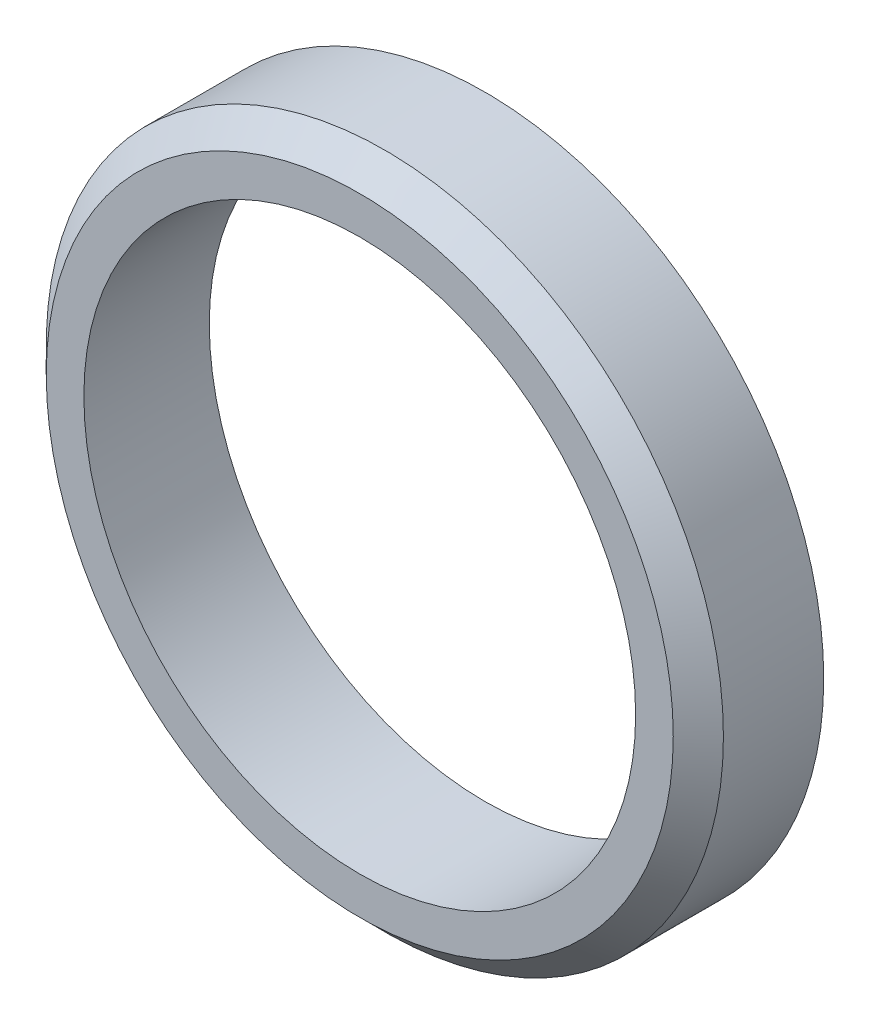
ISO-10303-21;
HEADER;
FILE_DESCRIPTION(('STEP AP214'),'2;1');
FILE_NAME('part.step','',(''),(''),'','','');
FILE_SCHEMA(('AUTOMOTIVE_DESIGN { 1 0 10303 214 1 1 1 1 }'));
ENDSEC;
DATA;
#1=APPLICATION_CONTEXT('core data for automotive mechanical design processes');
#2=APPLICATION_PROTOCOL_DEFINITION('international standard','automotive_design',2000,#1);
#3=PRODUCT_CONTEXT('',#1,'mechanical');
#4=PRODUCT('Part','Part','',(#3));
#5=PRODUCT_RELATED_PRODUCT_CATEGORY('part','',(#4));
#6=PRODUCT_DEFINITION_FORMATION('','',#4);
#7=PRODUCT_DEFINITION_CONTEXT('part definition',#1,'design');
#8=PRODUCT_DEFINITION('design','',#6,#7);
#9=PRODUCT_DEFINITION_SHAPE('','',#8);
#10=(LENGTH_UNIT() NAMED_UNIT(*) SI_UNIT(.MILLI.,.METRE.));
#11=(NAMED_UNIT(*) PLANE_ANGLE_UNIT() SI_UNIT($,.RADIAN.));
#12=(NAMED_UNIT(*) SI_UNIT($,.STERADIAN.) SOLID_ANGLE_UNIT());
#13=UNCERTAINTY_MEASURE_WITH_UNIT(LENGTH_MEASURE(1.E-05),#10,'distance_accuracy_value','');
#14=(GEOMETRIC_REPRESENTATION_CONTEXT(3) GLOBAL_UNCERTAINTY_ASSIGNED_CONTEXT((#13)) GLOBAL_UNIT_ASSIGNED_CONTEXT((#10,
#11,#12)) REPRESENTATION_CONTEXT('',''));
#15=CARTESIAN_POINT('',(0.,0.,0.));
#16=DIRECTION('',(0.,0.,1.));
#17=DIRECTION('',(1.,0.,0.));
#18=AXIS2_PLACEMENT_3D('',#15,#16,#17);
#19=CARTESIAN_POINT('',(0.,0.,25.));
#20=DIRECTION('',(0.,0.,-1.));
#21=DIRECTION('',(-1.,0.,0.));
#22=AXIS2_PLACEMENT_3D('',#19,#20,#21);
#23=CYLINDRICAL_SURFACE('',#22,67.5);
#24=CARTESIAN_POINT('',(0.,0.,20.));
#25=DIRECTION('',(0.,0.,1.));
#26=DIRECTION('',(1.,0.,0.));
#27=AXIS2_PLACEMENT_3D('',#24,#25,#26);
#28=CIRCLE('',#27,67.5);
#29=CARTESIAN_POINT('',(67.5,0.,20.));
#30=VERTEX_POINT('',#29);
#31=EDGE_CURVE('E10',#30,#30,#28,.F.);
#32=ORIENTED_EDGE('',*,*,#31,.T.);
#33=EDGE_LOOP('',(#32));
#34=FACE_BOUND('',#33,.T.);
#35=CARTESIAN_POINT('',(0.,0.,0.));
#36=DIRECTION('',(0.,0.,1.));
#37=DIRECTION('',(1.,0.,0.));
#38=AXIS2_PLACEMENT_3D('',#35,#36,#37);
#39=CIRCLE('',#38,67.5);
#40=CARTESIAN_POINT('',(67.5,0.,0.));
#41=VERTEX_POINT('',#40);
#42=EDGE_CURVE('E43',#41,#41,#39,.T.);
#43=ORIENTED_EDGE('',*,*,#42,.T.);
#44=EDGE_LOOP('',(#43));
#45=FACE_BOUND('',#44,.T.);
#46=ADVANCED_FACE('F32',(#34,#45),#23,.T.);
#47=CARTESIAN_POINT('',(0.,0.,25.));
#48=DIRECTION('',(0.,0.,1.));
#49=DIRECTION('',(1.,0.,0.));
#50=AXIS2_PLACEMENT_3D('',#47,#48,#49);
#51=PLANE('',#50);
#52=CARTESIAN_POINT('',(0.,0.,25.));
#53=DIRECTION('',(0.,0.,-1.));
#54=DIRECTION('',(-1.,0.,0.));
#55=AXIS2_PLACEMENT_3D('',#52,#53,#54);
#56=CIRCLE('',#55,55.);
#57=CARTESIAN_POINT('',(-55.,0.,25.));
#58=VERTEX_POINT('',#57);
#59=EDGE_CURVE('E47',#58,#58,#56,.T.);
#60=ORIENTED_EDGE('',*,*,#59,.T.);
#61=EDGE_LOOP('',(#60));
#62=FACE_BOUND('',#61,.T.);
#63=CARTESIAN_POINT('',(0.,0.,25.));
#64=DIRECTION('',(0.,0.,1.));
#65=DIRECTION('',(1.,0.,0.));
#66=AXIS2_PLACEMENT_3D('',#63,#64,#65);
#67=CIRCLE('',#66,62.5);
#68=CARTESIAN_POINT('',(62.5,0.,25.));
#69=VERTEX_POINT('',#68);
#70=EDGE_CURVE('E39',#69,#69,#67,.T.);
#71=ORIENTED_EDGE('',*,*,#70,.T.);
#72=EDGE_LOOP('',(#71));
#73=FACE_BOUND('',#72,.T.);
#74=ADVANCED_FACE('F56',(#62,#73),#51,.T.);
#75=CARTESIAN_POINT('',(0.,0.,0.));
#76=DIRECTION('',(0.,0.,1.));
#77=DIRECTION('',(1.,0.,0.));
#78=AXIS2_PLACEMENT_3D('',#75,#76,#77);
#79=PLANE('',#78);
#80=CARTESIAN_POINT('',(0.,0.,0.));
#81=DIRECTION('',(0.,0.,-1.));
#82=DIRECTION('',(-1.,0.,0.));
#83=AXIS2_PLACEMENT_3D('',#80,#81,#82);
#84=CIRCLE('',#83,55.);
#85=CARTESIAN_POINT('',(-55.,0.,0.));
#86=VERTEX_POINT('',#85);
#87=EDGE_CURVE('E50',#86,#86,#84,.T.);
#88=ORIENTED_EDGE('',*,*,#87,.F.);
#89=EDGE_LOOP('',(#88));
#90=FACE_BOUND('',#89,.T.);
#91=ORIENTED_EDGE('',*,*,#42,.F.);
#92=EDGE_LOOP('',(#91));
#93=FACE_BOUND('',#92,.T.);
#94=ADVANCED_FACE('F64',(#90,#93),#79,.F.);
#95=CARTESIAN_POINT('',(0.,0.,25.));
#96=DIRECTION('',(0.,0.,-1.));
#97=DIRECTION('',(-1.,0.,0.));
#98=AXIS2_PLACEMENT_3D('',#95,#96,#97);
#99=CONICAL_SURFACE('',#98,62.5,0.785398163397447);
#100=ORIENTED_EDGE('',*,*,#31,.F.);
#101=EDGE_LOOP('',(#100));
#102=FACE_BOUND('',#101,.T.);
#103=ORIENTED_EDGE('',*,*,#70,.F.);
#104=EDGE_LOOP('',(#103));
#105=FACE_BOUND('',#104,.T.);
#106=ADVANCED_FACE('F34',(#102,#105),#99,.T.);
#107=CARTESIAN_POINT('',(0.,0.,25.));
#108=DIRECTION('',(0.,0.,-1.));
#109=DIRECTION('',(-1.,0.,0.));
#110=AXIS2_PLACEMENT_3D('',#107,#108,#109);
#111=CYLINDRICAL_SURFACE('',#110,55.);
#112=ORIENTED_EDGE('',*,*,#59,.F.);
#113=EDGE_LOOP('',(#112));
#114=FACE_BOUND('',#113,.T.);
#115=ORIENTED_EDGE('',*,*,#87,.T.);
#116=EDGE_LOOP('',(#115));
#117=FACE_BOUND('',#116,.T.);
#118=ADVANCED_FACE('F58',(#114,#117),#111,.F.);
#119=CLOSED_SHELL('',(#46,#74,#94,#106,#118));
#120=MANIFOLD_SOLID_BREP('B2',#119);
#121=ADVANCED_BREP_SHAPE_REPRESENTATION('',(#18,#120),#14);
#122=SHAPE_DEFINITION_REPRESENTATION(#9,#121);
ENDSEC;
END-ISO-10303-21;
